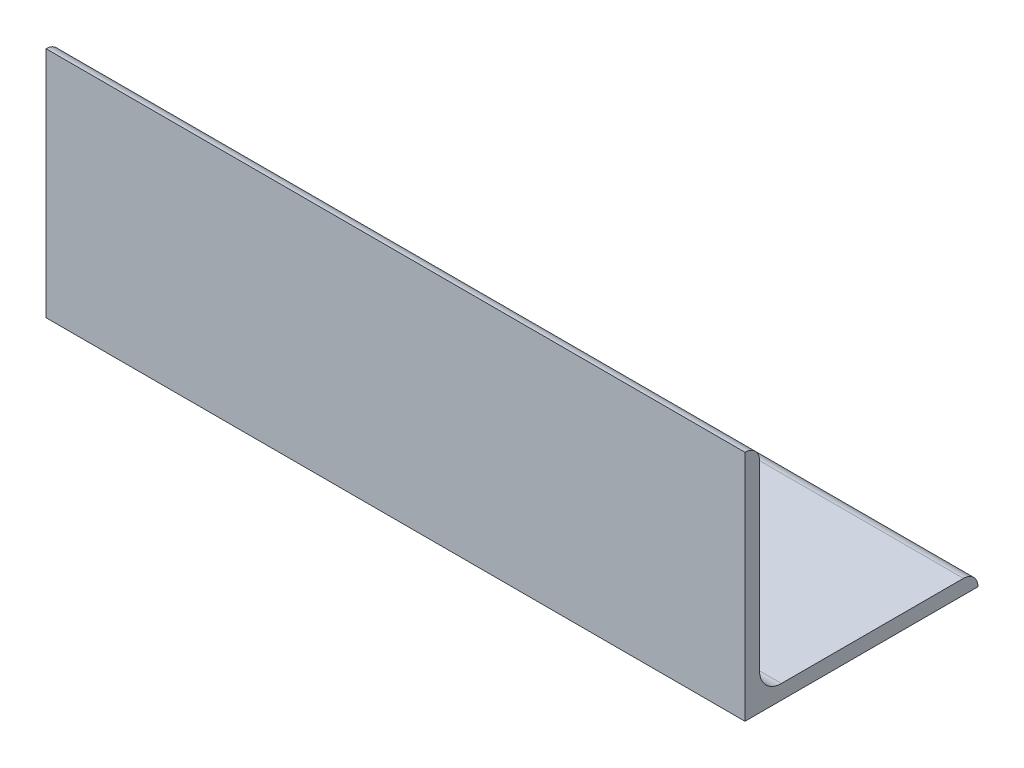
ISO-10303-21;
HEADER;
FILE_DESCRIPTION(('STEP AP214'),'2;1');
FILE_NAME('part.step','',(''),(''),'','','');
FILE_SCHEMA(('AUTOMOTIVE_DESIGN { 1 0 10303 214 1 1 1 1 }'));
ENDSEC;
DATA;
#1=APPLICATION_CONTEXT('core data for automotive mechanical design processes');
#2=APPLICATION_PROTOCOL_DEFINITION('international standard','automotive_design',2000,#1);
#3=PRODUCT_CONTEXT('',#1,'mechanical');
#4=PRODUCT('Part','Part','',(#3));
#5=PRODUCT_RELATED_PRODUCT_CATEGORY('part','',(#4));
#6=PRODUCT_DEFINITION_FORMATION('','',#4);
#7=PRODUCT_DEFINITION_CONTEXT('part definition',#1,'design');
#8=PRODUCT_DEFINITION('design','',#6,#7);
#9=PRODUCT_DEFINITION_SHAPE('','',#8);
#10=(LENGTH_UNIT() NAMED_UNIT(*) SI_UNIT(.MILLI.,.METRE.));
#11=(NAMED_UNIT(*) PLANE_ANGLE_UNIT() SI_UNIT($,.RADIAN.));
#12=(NAMED_UNIT(*) SI_UNIT($,.STERADIAN.) SOLID_ANGLE_UNIT());
#13=UNCERTAINTY_MEASURE_WITH_UNIT(LENGTH_MEASURE(1.E-05),#10,'distance_accuracy_value','');
#14=(GEOMETRIC_REPRESENTATION_CONTEXT(3) GLOBAL_UNCERTAINTY_ASSIGNED_CONTEXT((#13)) GLOBAL_UNIT_ASSIGNED_CONTEXT((#10,
#11,#12)) REPRESENTATION_CONTEXT('',''));
#15=CARTESIAN_POINT('',(0.,0.,0.));
#16=DIRECTION('',(0.,0.,1.));
#17=DIRECTION('',(1.,0.,0.));
#18=AXIS2_PLACEMENT_3D('',#15,#16,#17);
#19=CARTESIAN_POINT('',(152.4,0.,-50.8));
#20=DIRECTION('',(0.,1.,0.));
#21=DIRECTION('',(0.,0.,1.));
#22=AXIS2_PLACEMENT_3D('',#19,#20,#21);
#23=PLANE('',#22);
#24=DIRECTION('',(0.,0.,-1.));
#25=VECTOR('',#24,1.);
#26=CARTESIAN_POINT('',(0.,0.,-50.8));
#27=LINE('',#26,#25);
#28=CARTESIAN_POINT('',(0.,0.,0.));
#29=VERTEX_POINT('',#28);
#30=CARTESIAN_POINT('',(0.,0.,-50.8));
#31=VERTEX_POINT('',#30);
#32=EDGE_CURVE('E11',#29,#31,#27,.T.);
#33=ORIENTED_EDGE('',*,*,#32,.T.);
#34=DIRECTION('',(-1.,0.,0.));
#35=VECTOR('',#34,1.);
#36=CARTESIAN_POINT('',(152.4,0.,-50.8));
#37=LINE('',#36,#35);
#38=CARTESIAN_POINT('',(152.4,0.,-50.8));
#39=VERTEX_POINT('',#38);
#40=EDGE_CURVE('E36',#39,#31,#37,.T.);
#41=ORIENTED_EDGE('',*,*,#40,.F.);
#42=DIRECTION('',(0.,0.,-1.));
#43=VECTOR('',#42,1.);
#44=CARTESIAN_POINT('',(152.4,0.,-50.8));
#45=LINE('',#44,#43);
#46=CARTESIAN_POINT('',(152.4,0.,0.));
#47=VERTEX_POINT('',#46);
#48=EDGE_CURVE('E104',#47,#39,#45,.T.);
#49=ORIENTED_EDGE('',*,*,#48,.F.);
#50=DIRECTION('',(-1.,0.,0.));
#51=VECTOR('',#50,1.);
#52=CARTESIAN_POINT('',(152.4,0.,0.));
#53=LINE('',#52,#51);
#54=EDGE_CURVE('E27',#47,#29,#53,.T.);
#55=ORIENTED_EDGE('',*,*,#54,.T.);
#56=EDGE_LOOP('',(#33,#41,#49,#55));
#57=FACE_BOUND('',#56,.T.);
#58=ADVANCED_FACE('F17',(#57),#23,.F.);
#59=CARTESIAN_POINT('',(152.4,0.00508,-50.8));
#60=DIRECTION('',(0.,0.,1.));
#61=DIRECTION('',(1.,0.,0.));
#62=AXIS2_PLACEMENT_3D('',#59,#60,#61);
#63=PLANE('',#62);
#64=DIRECTION('',(0.,1.,0.));
#65=VECTOR('',#64,1.);
#66=CARTESIAN_POINT('',(0.,0.00508,-50.8));
#67=LINE('',#66,#65);
#68=CARTESIAN_POINT('',(0.,0.00508,-50.8));
#69=VERTEX_POINT('',#68);
#70=EDGE_CURVE('E111',#31,#69,#67,.T.);
#71=ORIENTED_EDGE('',*,*,#70,.T.);
#72=DIRECTION('',(-1.,0.,0.));
#73=VECTOR('',#72,1.);
#74=CARTESIAN_POINT('',(152.4,0.00508,-50.8));
#75=LINE('',#74,#73);
#76=CARTESIAN_POINT('',(152.4,0.00508,-50.8));
#77=VERTEX_POINT('',#76);
#78=EDGE_CURVE('E117',#77,#69,#75,.T.);
#79=ORIENTED_EDGE('',*,*,#78,.F.);
#80=DIRECTION('',(0.,1.,0.));
#81=VECTOR('',#80,1.);
#82=CARTESIAN_POINT('',(152.4,0.00508,-50.8));
#83=LINE('',#82,#81);
#84=EDGE_CURVE('E121',#39,#77,#83,.T.);
#85=ORIENTED_EDGE('',*,*,#84,.F.);
#86=ORIENTED_EDGE('',*,*,#40,.T.);
#87=EDGE_LOOP('',(#71,#79,#85,#86));
#88=FACE_BOUND('',#87,.T.);
#89=ADVANCED_FACE('F164',(#88),#63,.F.);
#90=CARTESIAN_POINT('',(152.4,0.00507999999999961,-47.63008));
#91=DIRECTION('',(-1.,0.,0.));
#92=DIRECTION('',(0.,0.,1.));
#93=AXIS2_PLACEMENT_3D('',#90,#91,#92);
#94=CYLINDRICAL_SURFACE('',#93,3.16992);
#95=CARTESIAN_POINT('',(0.,0.00507999999999961,-47.63008));
#96=DIRECTION('',(1.,0.,0.));
#97=DIRECTION('',(0.,0.,-1.));
#98=AXIS2_PLACEMENT_3D('',#95,#96,#97);
#99=CIRCLE('',#98,3.16992);
#100=CARTESIAN_POINT('',(0.,3.175,-47.63008));
#101=VERTEX_POINT('',#100);
#102=EDGE_CURVE('E119',#69,#101,#99,.T.);
#103=ORIENTED_EDGE('',*,*,#102,.T.);
#104=DIRECTION('',(-1.,0.,0.));
#105=VECTOR('',#104,1.);
#106=CARTESIAN_POINT('',(152.4,3.175,-47.63008));
#107=LINE('',#106,#105);
#108=CARTESIAN_POINT('',(152.4,3.175,-47.63008));
#109=VERTEX_POINT('',#108);
#110=EDGE_CURVE('E126',#109,#101,#107,.T.);
#111=ORIENTED_EDGE('',*,*,#110,.F.);
#112=CARTESIAN_POINT('',(152.4,0.00507999999999961,-47.63008));
#113=DIRECTION('',(1.,0.,0.));
#114=DIRECTION('',(0.,0.,-1.));
#115=AXIS2_PLACEMENT_3D('',#112,#113,#114);
#116=CIRCLE('',#115,3.16992);
#117=EDGE_CURVE('E123',#77,#109,#116,.T.);
#118=ORIENTED_EDGE('',*,*,#117,.F.);
#119=ORIENTED_EDGE('',*,*,#78,.T.);
#120=EDGE_LOOP('',(#103,#111,#118,#119));
#121=FACE_BOUND('',#120,.T.);
#122=ADVANCED_FACE('F170',(#121),#94,.T.);
#123=CARTESIAN_POINT('',(152.4,3.17499999999999,-7.93750000000001));
#124=DIRECTION('',(0.,-1.,0.));
#125=DIRECTION('',(0.,0.,-1.));
#126=AXIS2_PLACEMENT_3D('',#123,#124,#125);
#127=PLANE('',#126);
#128=DIRECTION('',(0.,0.,1.));
#129=VECTOR('',#128,1.);
#130=CARTESIAN_POINT('',(0.,3.17499999999999,-7.93750000000001));
#131=LINE('',#130,#129);
#132=CARTESIAN_POINT('',(0.,3.17499999999999,-7.93750000000002));
#133=VERTEX_POINT('',#132);
#134=EDGE_CURVE('E120',#101,#133,#131,.T.);
#135=ORIENTED_EDGE('',*,*,#134,.T.);
#136=DIRECTION('',(-1.,0.,0.));
#137=VECTOR('',#136,1.);
#138=CARTESIAN_POINT('',(152.4,3.17499999999999,-7.93750000000002));
#139=LINE('',#138,#137);
#140=CARTESIAN_POINT('',(152.4,3.17499999999999,-7.93750000000002));
#141=VERTEX_POINT('',#140);
#142=EDGE_CURVE('E133',#141,#133,#139,.T.);
#143=ORIENTED_EDGE('',*,*,#142,.F.);
#144=DIRECTION('',(0.,0.,1.));
#145=VECTOR('',#144,1.);
#146=CARTESIAN_POINT('',(152.4,3.17499999999999,-7.93750000000001));
#147=LINE('',#146,#145);
#148=EDGE_CURVE('E130',#109,#141,#147,.T.);
#149=ORIENTED_EDGE('',*,*,#148,.F.);
#150=ORIENTED_EDGE('',*,*,#110,.T.);
#151=EDGE_LOOP('',(#135,#143,#149,#150));
#152=FACE_BOUND('',#151,.T.);
#153=ADVANCED_FACE('F173',(#152),#127,.F.);
#154=CARTESIAN_POINT('',(152.4,7.93749999999999,-7.93750000000001));
#155=DIRECTION('',(-1.,0.,0.));
#156=DIRECTION('',(0.,0.,1.));
#157=AXIS2_PLACEMENT_3D('',#154,#155,#156);
#158=CYLINDRICAL_SURFACE('',#157,4.7625);
#159=CARTESIAN_POINT('',(0.,7.93749999999999,-7.93750000000001));
#160=DIRECTION('',(-1.,0.,0.));
#161=DIRECTION('',(0.,0.,1.));
#162=AXIS2_PLACEMENT_3D('',#159,#160,#161);
#163=CIRCLE('',#162,4.7625);
#164=CARTESIAN_POINT('',(0.,7.93749999999999,-3.17500000000001));
#165=VERTEX_POINT('',#164);
#166=EDGE_CURVE('E128',#133,#165,#163,.T.);
#167=ORIENTED_EDGE('',*,*,#166,.T.);
#168=DIRECTION('',(-1.,0.,0.));
#169=VECTOR('',#168,1.);
#170=CARTESIAN_POINT('',(152.4,7.93749999999999,-3.17500000000001));
#171=LINE('',#170,#169);
#172=CARTESIAN_POINT('',(152.4,7.93749999999999,-3.17500000000001));
#173=VERTEX_POINT('',#172);
#174=EDGE_CURVE('E140',#173,#165,#171,.T.);
#175=ORIENTED_EDGE('',*,*,#174,.F.);
#176=CARTESIAN_POINT('',(152.4,7.93749999999999,-7.93750000000001));
#177=DIRECTION('',(-1.,0.,0.));
#178=DIRECTION('',(0.,0.,1.));
#179=AXIS2_PLACEMENT_3D('',#176,#177,#178);
#180=CIRCLE('',#179,4.7625);
#181=EDGE_CURVE('E137',#141,#173,#180,.T.);
#182=ORIENTED_EDGE('',*,*,#181,.F.);
#183=ORIENTED_EDGE('',*,*,#142,.T.);
#184=EDGE_LOOP('',(#167,#175,#182,#183));
#185=FACE_BOUND('',#184,.T.);
#186=ADVANCED_FACE('F178',(#185),#158,.F.);
#187=CARTESIAN_POINT('',(152.4,47.63008,-3.175));
#188=DIRECTION('',(0.,0.,1.));
#189=DIRECTION('',(0.,-1.,0.));
#190=AXIS2_PLACEMENT_3D('',#187,#188,#189);
#191=PLANE('',#190);
#192=DIRECTION('',(0.,1.,0.));
#193=VECTOR('',#192,1.);
#194=CARTESIAN_POINT('',(0.,47.63008,-3.175));
#195=LINE('',#194,#193);
#196=CARTESIAN_POINT('',(0.,47.63008,-3.175));
#197=VERTEX_POINT('',#196);
#198=EDGE_CURVE('E135',#165,#197,#195,.T.);
#199=ORIENTED_EDGE('',*,*,#198,.T.);
#200=DIRECTION('',(-1.,0.,0.));
#201=VECTOR('',#200,1.);
#202=CARTESIAN_POINT('',(152.4,47.63008,-3.175));
#203=LINE('',#202,#201);
#204=CARTESIAN_POINT('',(152.4,47.63008,-3.175));
#205=VERTEX_POINT('',#204);
#206=EDGE_CURVE('E147',#205,#197,#203,.T.);
#207=ORIENTED_EDGE('',*,*,#206,.F.);
#208=DIRECTION('',(0.,1.,0.));
#209=VECTOR('',#208,1.);
#210=CARTESIAN_POINT('',(152.4,47.63008,-3.175));
#211=LINE('',#210,#209);
#212=EDGE_CURVE('E144',#173,#205,#211,.T.);
#213=ORIENTED_EDGE('',*,*,#212,.F.);
#214=ORIENTED_EDGE('',*,*,#174,.T.);
#215=EDGE_LOOP('',(#199,#207,#213,#214));
#216=FACE_BOUND('',#215,.T.);
#217=ADVANCED_FACE('F181',(#216),#191,.F.);
#218=CARTESIAN_POINT('',(152.4,47.63008,-0.00508000000000019));
#219=DIRECTION('',(-1.,0.,0.));
#220=DIRECTION('',(0.,0.,1.));
#221=AXIS2_PLACEMENT_3D('',#218,#219,#220);
#222=CYLINDRICAL_SURFACE('',#221,3.16992);
#223=CARTESIAN_POINT('',(0.,47.63008,-0.00508000000000019));
#224=DIRECTION('',(1.,0.,0.));
#225=DIRECTION('',(0.,0.,1.));
#226=AXIS2_PLACEMENT_3D('',#223,#224,#225);
#227=CIRCLE('',#226,3.16992);
#228=CARTESIAN_POINT('',(0.,50.8,-0.00508));
#229=VERTEX_POINT('',#228);
#230=EDGE_CURVE('E142',#197,#229,#227,.T.);
#231=ORIENTED_EDGE('',*,*,#230,.T.);
#232=DIRECTION('',(-1.,0.,0.));
#233=VECTOR('',#232,1.);
#234=CARTESIAN_POINT('',(152.4,50.8,-0.00508));
#235=LINE('',#234,#233);
#236=CARTESIAN_POINT('',(152.4,50.8,-0.00508));
#237=VERTEX_POINT('',#236);
#238=EDGE_CURVE('E152',#237,#229,#235,.T.);
#239=ORIENTED_EDGE('',*,*,#238,.F.);
#240=CARTESIAN_POINT('',(152.4,47.63008,-0.00508000000000019));
#241=DIRECTION('',(1.,0.,0.));
#242=DIRECTION('',(0.,0.,1.));
#243=AXIS2_PLACEMENT_3D('',#240,#241,#242);
#244=CIRCLE('',#243,3.16992);
#245=EDGE_CURVE('E95',#205,#237,#244,.T.);
#246=ORIENTED_EDGE('',*,*,#245,.F.);
#247=ORIENTED_EDGE('',*,*,#206,.T.);
#248=EDGE_LOOP('',(#231,#239,#246,#247));
#249=FACE_BOUND('',#248,.T.);
#250=ADVANCED_FACE('F157',(#249),#222,.T.);
#251=CARTESIAN_POINT('',(152.4,50.8,0.));
#252=DIRECTION('',(0.,-1.,0.));
#253=DIRECTION('',(0.,0.,-1.));
#254=AXIS2_PLACEMENT_3D('',#251,#252,#253);
#255=PLANE('',#254);
#256=DIRECTION('',(0.,0.,1.));
#257=VECTOR('',#256,1.);
#258=CARTESIAN_POINT('',(0.,50.8,0.));
#259=LINE('',#258,#257);
#260=CARTESIAN_POINT('',(0.,50.8,0.));
#261=VERTEX_POINT('',#260);
#262=EDGE_CURVE('E101',#229,#261,#259,.T.);
#263=ORIENTED_EDGE('',*,*,#262,.T.);
#264=DIRECTION('',(-1.,0.,0.));
#265=VECTOR('',#264,1.);
#266=CARTESIAN_POINT('',(152.4,50.8,0.));
#267=LINE('',#266,#265);
#268=CARTESIAN_POINT('',(152.4,50.8,0.));
#269=VERTEX_POINT('',#268);
#270=EDGE_CURVE('E86',#269,#261,#267,.T.);
#271=ORIENTED_EDGE('',*,*,#270,.F.);
#272=DIRECTION('',(0.,0.,1.));
#273=VECTOR('',#272,1.);
#274=CARTESIAN_POINT('',(152.4,50.8,0.));
#275=LINE('',#274,#273);
#276=EDGE_CURVE('E92',#237,#269,#275,.T.);
#277=ORIENTED_EDGE('',*,*,#276,.F.);
#278=ORIENTED_EDGE('',*,*,#238,.T.);
#279=EDGE_LOOP('',(#263,#271,#277,#278));
#280=FACE_BOUND('',#279,.T.);
#281=ADVANCED_FACE('F99',(#280),#255,.F.);
#282=CARTESIAN_POINT('',(152.4,0.,0.));
#283=DIRECTION('',(0.,0.,-1.));
#284=DIRECTION('',(-1.,0.,0.));
#285=AXIS2_PLACEMENT_3D('',#282,#283,#284);
#286=PLANE('',#285);
#287=DIRECTION('',(0.,-1.,0.));
#288=VECTOR('',#287,1.);
#289=CARTESIAN_POINT('',(0.,0.,0.));
#290=LINE('',#289,#288);
#291=EDGE_CURVE('E103',#261,#29,#290,.T.);
#292=ORIENTED_EDGE('',*,*,#291,.T.);
#293=ORIENTED_EDGE('',*,*,#54,.F.);
#294=DIRECTION('',(0.,-1.,0.));
#295=VECTOR('',#294,1.);
#296=CARTESIAN_POINT('',(152.4,0.,0.));
#297=LINE('',#296,#295);
#298=EDGE_CURVE('E21',#269,#47,#297,.T.);
#299=ORIENTED_EDGE('',*,*,#298,.F.);
#300=ORIENTED_EDGE('',*,*,#270,.T.);
#301=EDGE_LOOP('',(#292,#293,#299,#300));
#302=FACE_BOUND('',#301,.T.);
#303=ADVANCED_FACE('F107',(#302),#286,.F.);
#304=CARTESIAN_POINT('',(152.4,47.63008,-0.00508000000000019));
#305=DIRECTION('',(-1.,0.,0.));
#306=DIRECTION('',(0.,0.,1.));
#307=AXIS2_PLACEMENT_3D('',#304,#305,#306);
#308=PLANE('',#307);
#309=ORIENTED_EDGE('',*,*,#48,.T.);
#310=ORIENTED_EDGE('',*,*,#84,.T.);
#311=ORIENTED_EDGE('',*,*,#117,.T.);
#312=ORIENTED_EDGE('',*,*,#148,.T.);
#313=ORIENTED_EDGE('',*,*,#181,.T.);
#314=ORIENTED_EDGE('',*,*,#212,.T.);
#315=ORIENTED_EDGE('',*,*,#245,.T.);
#316=ORIENTED_EDGE('',*,*,#276,.T.);
#317=ORIENTED_EDGE('',*,*,#298,.T.);
#318=EDGE_LOOP('',(#309,#310,#311,#312,#313,#314,#315,#316,#317));
#319=FACE_BOUND('',#318,.T.);
#320=ADVANCED_FACE('F93',(#319),#308,.F.);
#321=CARTESIAN_POINT('',(0.,47.63008,-0.00508000000000019));
#322=DIRECTION('',(-1.,0.,0.));
#323=DIRECTION('',(0.,0.,1.));
#324=AXIS2_PLACEMENT_3D('',#321,#322,#323);
#325=PLANE('',#324);
#326=ORIENTED_EDGE('',*,*,#32,.F.);
#327=ORIENTED_EDGE('',*,*,#291,.F.);
#328=ORIENTED_EDGE('',*,*,#262,.F.);
#329=ORIENTED_EDGE('',*,*,#230,.F.);
#330=ORIENTED_EDGE('',*,*,#198,.F.);
#331=ORIENTED_EDGE('',*,*,#166,.F.);
#332=ORIENTED_EDGE('',*,*,#134,.F.);
#333=ORIENTED_EDGE('',*,*,#102,.F.);
#334=ORIENTED_EDGE('',*,*,#70,.F.);
#335=EDGE_LOOP('',(#326,#327,#328,#329,#330,#331,#332,#333,#334));
#336=FACE_BOUND('',#335,.T.);
#337=ADVANCED_FACE('F19',(#336),#325,.T.);
#338=CLOSED_SHELL('',(#58,#89,#122,#153,#186,#217,#250,#281,#303,#320,#337));
#339=MANIFOLD_SOLID_BREP('B1',#338);
#340=ADVANCED_BREP_SHAPE_REPRESENTATION('',(#18,#339),#14);
#341=SHAPE_DEFINITION_REPRESENTATION(#9,#340);
ENDSEC;
END-ISO-10303-21;
